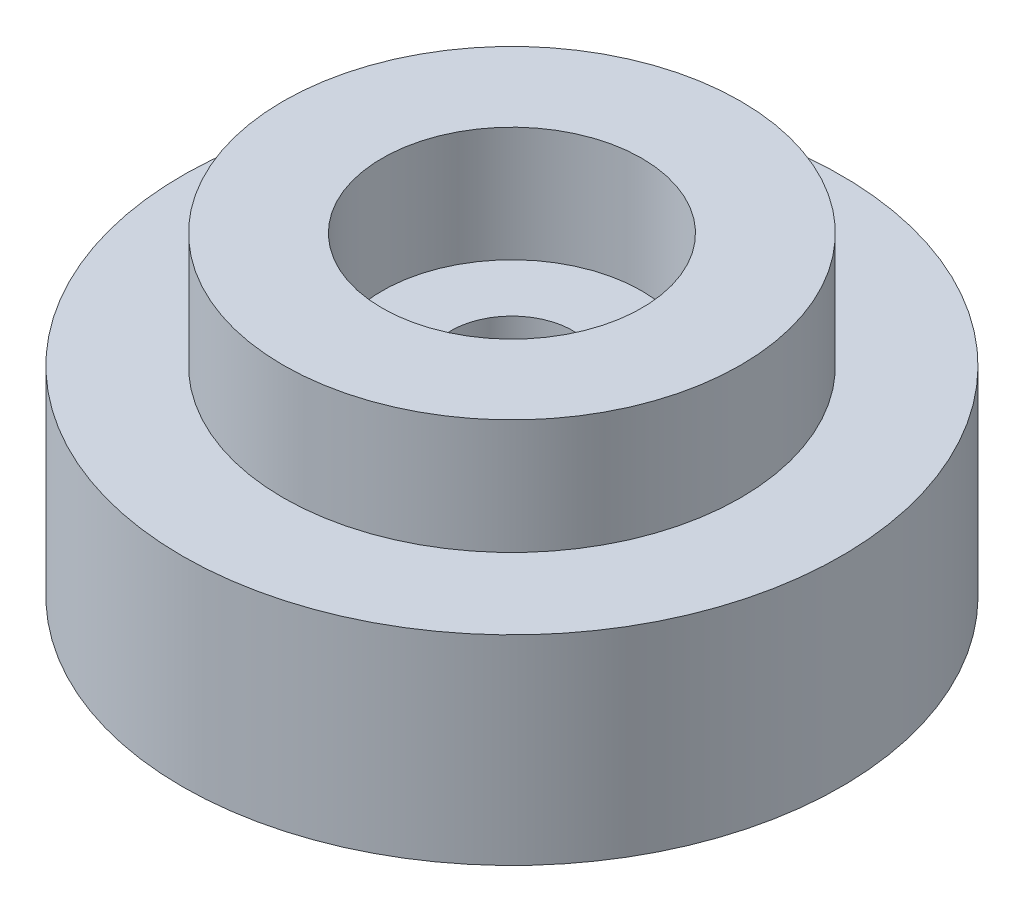
ISO-10303-21;
HEADER;
FILE_DESCRIPTION(('STEP AP214'),'2;1');
FILE_NAME('part.step','',(''),(''),'','','');
FILE_SCHEMA(('AUTOMOTIVE_DESIGN { 1 0 10303 214 1 1 1 1 }'));
ENDSEC;
DATA;
#1=APPLICATION_CONTEXT('core data for automotive mechanical design processes');
#2=APPLICATION_PROTOCOL_DEFINITION('international standard','automotive_design',2000,#1);
#3=PRODUCT_CONTEXT('',#1,'mechanical');
#4=PRODUCT('Part','Part','',(#3));
#5=PRODUCT_RELATED_PRODUCT_CATEGORY('part','',(#4));
#6=PRODUCT_DEFINITION_FORMATION('','',#4);
#7=PRODUCT_DEFINITION_CONTEXT('part definition',#1,'design');
#8=PRODUCT_DEFINITION('design','',#6,#7);
#9=PRODUCT_DEFINITION_SHAPE('','',#8);
#10=(LENGTH_UNIT() NAMED_UNIT(*) SI_UNIT(.MILLI.,.METRE.));
#11=(NAMED_UNIT(*) PLANE_ANGLE_UNIT() SI_UNIT($,.RADIAN.));
#12=(NAMED_UNIT(*) SI_UNIT($,.STERADIAN.) SOLID_ANGLE_UNIT());
#13=UNCERTAINTY_MEASURE_WITH_UNIT(LENGTH_MEASURE(1.E-05),#10,'distance_accuracy_value','');
#14=(GEOMETRIC_REPRESENTATION_CONTEXT(3) GLOBAL_UNCERTAINTY_ASSIGNED_CONTEXT((#13)) GLOBAL_UNIT_ASSIGNED_CONTEXT((#10,
#11,#12)) REPRESENTATION_CONTEXT('',''));
#15=CARTESIAN_POINT('',(0.,0.,0.));
#16=DIRECTION('',(0.,0.,1.));
#17=DIRECTION('',(1.,0.,0.));
#18=AXIS2_PLACEMENT_3D('',#15,#16,#17);
#19=CARTESIAN_POINT('',(0.,10.,0.));
#20=DIRECTION('',(0.,-1.,0.));
#21=DIRECTION('',(0.,0.,-1.));
#22=AXIS2_PLACEMENT_3D('',#19,#20,#21);
#23=CYLINDRICAL_SURFACE('',#22,16.5);
#24=CARTESIAN_POINT('',(0.,10.,0.));
#25=DIRECTION('',(0.,1.,0.));
#26=DIRECTION('',(0.,0.,1.));
#27=AXIS2_PLACEMENT_3D('',#24,#25,#26);
#28=CIRCLE('',#27,16.5);
#29=CARTESIAN_POINT('',(0.,10.,16.5));
#30=VERTEX_POINT('',#29);
#31=EDGE_CURVE('E42',#30,#30,#28,.T.);
#32=ORIENTED_EDGE('',*,*,#31,.F.);
#33=EDGE_LOOP('',(#32));
#34=FACE_BOUND('',#33,.T.);
#35=CARTESIAN_POINT('',(0.,0.,0.));
#36=DIRECTION('',(0.,1.,0.));
#37=DIRECTION('',(0.,0.,1.));
#38=AXIS2_PLACEMENT_3D('',#35,#36,#37);
#39=CIRCLE('',#38,16.5);
#40=CARTESIAN_POINT('',(0.,0.,16.5));
#41=VERTEX_POINT('',#40);
#42=EDGE_CURVE('E47',#41,#41,#39,.T.);
#43=ORIENTED_EDGE('',*,*,#42,.T.);
#44=EDGE_LOOP('',(#43));
#45=FACE_BOUND('',#44,.T.);
#46=ADVANCED_FACE('F35',(#34,#45),#23,.T.);
#47=CARTESIAN_POINT('',(0.,10.,0.));
#48=DIRECTION('',(0.,1.,0.));
#49=DIRECTION('',(0.,0.,1.));
#50=AXIS2_PLACEMENT_3D('',#47,#48,#49);
#51=PLANE('',#50);
#52=CARTESIAN_POINT('',(0.,10.,0.));
#53=DIRECTION('',(0.,-1.,0.));
#54=DIRECTION('',(0.,0.,-1.));
#55=AXIS2_PLACEMENT_3D('',#52,#53,#54);
#56=CIRCLE('',#55,11.45);
#57=CARTESIAN_POINT('',(0.,10.,-11.45));
#58=VERTEX_POINT('',#57);
#59=EDGE_CURVE('E52',#58,#58,#56,.T.);
#60=ORIENTED_EDGE('',*,*,#59,.T.);
#61=EDGE_LOOP('',(#60));
#62=FACE_BOUND('',#61,.T.);
#63=ORIENTED_EDGE('',*,*,#31,.T.);
#64=EDGE_LOOP('',(#63));
#65=FACE_BOUND('',#64,.T.);
#66=ADVANCED_FACE('F73',(#62,#65),#51,.T.);
#67=CARTESIAN_POINT('',(0.,0.,0.));
#68=DIRECTION('',(0.,1.,0.));
#69=DIRECTION('',(0.,0.,1.));
#70=AXIS2_PLACEMENT_3D('',#67,#68,#69);
#71=PLANE('',#70);
#72=CARTESIAN_POINT('',(0.,0.,0.));
#73=DIRECTION('',(0.,1.,0.));
#74=DIRECTION('',(0.,0.,1.));
#75=AXIS2_PLACEMENT_3D('',#72,#73,#74);
#76=CIRCLE('',#75,2.);
#77=CARTESIAN_POINT('',(0.,0.,2.));
#78=VERTEX_POINT('',#77);
#79=EDGE_CURVE('E51',#78,#78,#76,.T.);
#80=ORIENTED_EDGE('',*,*,#79,.T.);
#81=EDGE_LOOP('',(#80));
#82=FACE_BOUND('',#81,.T.);
#83=ORIENTED_EDGE('',*,*,#42,.F.);
#84=EDGE_LOOP('',(#83));
#85=FACE_BOUND('',#84,.T.);
#86=ADVANCED_FACE('F70',(#82,#85),#71,.F.);
#87=CARTESIAN_POINT('',(0.,-0.517946451325177,0.));
#88=DIRECTION('',(0.,-1.,0.));
#89=DIRECTION('',(0.,0.,-1.));
#90=AXIS2_PLACEMENT_3D('',#87,#88,#89);
#91=CYLINDRICAL_SURFACE('',#90,6.5);
#92=CARTESIAN_POINT('',(0.,10.,0.));
#93=DIRECTION('',(0.,-1.,0.));
#94=DIRECTION('',(0.,0.,-1.));
#95=AXIS2_PLACEMENT_3D('',#92,#93,#94);
#96=CIRCLE('',#95,6.5);
#97=CARTESIAN_POINT('',(0.,10.,-6.5));
#98=VERTEX_POINT('',#97);
#99=EDGE_CURVE('E10',#98,#98,#96,.T.);
#100=ORIENTED_EDGE('',*,*,#99,.T.);
#101=EDGE_LOOP('',(#100));
#102=FACE_BOUND('',#101,.T.);
#103=CARTESIAN_POINT('',(0.,15.75,0.));
#104=DIRECTION('',(0.,-1.,0.));
#105=DIRECTION('',(0.,0.,-1.));
#106=AXIS2_PLACEMENT_3D('',#103,#104,#105);
#107=CIRCLE('',#106,6.5);
#108=CARTESIAN_POINT('',(0.,15.75,-6.5));
#109=VERTEX_POINT('',#108);
#110=EDGE_CURVE('E58',#109,#109,#107,.T.);
#111=ORIENTED_EDGE('',*,*,#110,.F.);
#112=EDGE_LOOP('',(#111));
#113=FACE_BOUND('',#112,.T.);
#114=ADVANCED_FACE('F72',(#102,#113),#91,.F.);
#115=CARTESIAN_POINT('',(6.5,15.75,0.));
#116=DIRECTION('',(0.,1.,0.));
#117=DIRECTION('',(0.,0.,1.));
#118=AXIS2_PLACEMENT_3D('',#115,#116,#117);
#119=PLANE('',#118);
#120=ORIENTED_EDGE('',*,*,#110,.T.);
#121=EDGE_LOOP('',(#120));
#122=FACE_BOUND('',#121,.T.);
#123=CARTESIAN_POINT('',(0.,15.75,0.));
#124=DIRECTION('',(0.,-1.,0.));
#125=DIRECTION('',(0.,0.,-1.));
#126=AXIS2_PLACEMENT_3D('',#123,#124,#125);
#127=CIRCLE('',#126,11.45);
#128=CARTESIAN_POINT('',(0.,15.75,-11.45));
#129=VERTEX_POINT('',#128);
#130=EDGE_CURVE('E55',#129,#129,#127,.T.);
#131=ORIENTED_EDGE('',*,*,#130,.F.);
#132=EDGE_LOOP('',(#131));
#133=FACE_BOUND('',#132,.T.);
#134=ADVANCED_FACE('F79',(#122,#133),#119,.T.);
#135=CARTESIAN_POINT('',(0.,-0.517946451325177,0.));
#136=DIRECTION('',(0.,-1.,0.));
#137=DIRECTION('',(0.,0.,-1.));
#138=AXIS2_PLACEMENT_3D('',#135,#136,#137);
#139=CYLINDRICAL_SURFACE('',#138,11.45);
#140=ORIENTED_EDGE('',*,*,#130,.T.);
#141=EDGE_LOOP('',(#140));
#142=FACE_BOUND('',#141,.T.);
#143=ORIENTED_EDGE('',*,*,#59,.F.);
#144=EDGE_LOOP('',(#143));
#145=FACE_BOUND('',#144,.T.);
#146=ADVANCED_FACE('F119',(#142,#145),#139,.T.);
#147=CARTESIAN_POINT('',(0.,8.75,0.));
#148=DIRECTION('',(0.,1.,0.));
#149=DIRECTION('',(0.,0.,1.));
#150=AXIS2_PLACEMENT_3D('',#147,#148,#149);
#151=PLANE('',#150);
#152=CARTESIAN_POINT('',(0.,8.75,0.));
#153=DIRECTION('',(0.,1.,0.));
#154=DIRECTION('',(0.,0.,1.));
#155=AXIS2_PLACEMENT_3D('',#152,#153,#154);
#156=CIRCLE('',#155,2.);
#157=CARTESIAN_POINT('',(0.,8.75,2.));
#158=VERTEX_POINT('',#157);
#159=EDGE_CURVE('E38',#158,#158,#156,.T.);
#160=ORIENTED_EDGE('',*,*,#159,.F.);
#161=EDGE_LOOP('',(#160));
#162=FACE_BOUND('',#161,.T.);
#163=CARTESIAN_POINT('',(0.,8.75,0.));
#164=DIRECTION('',(0.,1.,0.));
#165=DIRECTION('',(0.,0.,1.));
#166=AXIS2_PLACEMENT_3D('',#163,#164,#165);
#167=CIRCLE('',#166,3.05);
#168=CARTESIAN_POINT('',(0.,8.75,3.05));
#169=VERTEX_POINT('',#168);
#170=EDGE_CURVE('E62',#169,#169,#167,.T.);
#171=ORIENTED_EDGE('',*,*,#170,.T.);
#172=EDGE_LOOP('',(#171));
#173=FACE_BOUND('',#172,.T.);
#174=ADVANCED_FACE('F130',(#162,#173),#151,.T.);
#175=CARTESIAN_POINT('',(0.,8.75,0.));
#176=DIRECTION('',(0.,1.,0.));
#177=DIRECTION('',(0.,0.,1.));
#178=AXIS2_PLACEMENT_3D('',#175,#176,#177);
#179=CYLINDRICAL_SURFACE('',#178,3.05);
#180=ORIENTED_EDGE('',*,*,#170,.F.);
#181=EDGE_LOOP('',(#180));
#182=FACE_BOUND('',#181,.T.);
#183=CARTESIAN_POINT('',(0.,10.,0.));
#184=DIRECTION('',(0.,1.,0.));
#185=DIRECTION('',(0.,0.,1.));
#186=AXIS2_PLACEMENT_3D('',#183,#184,#185);
#187=CIRCLE('',#186,3.05);
#188=CARTESIAN_POINT('',(0.,10.,3.05));
#189=VERTEX_POINT('',#188);
#190=EDGE_CURVE('E61',#189,#189,#187,.T.);
#191=ORIENTED_EDGE('',*,*,#190,.T.);
#192=EDGE_LOOP('',(#191));
#193=FACE_BOUND('',#192,.T.);
#194=ADVANCED_FACE('F103',(#182,#193),#179,.F.);
#195=ORIENTED_EDGE('',*,*,#190,.F.);
#196=EDGE_LOOP('',(#195));
#197=FACE_BOUND('',#196,.T.);
#198=ORIENTED_EDGE('',*,*,#99,.F.);
#199=EDGE_LOOP('',(#198));
#200=FACE_BOUND('',#199,.T.);
#201=ADVANCED_FACE('F83',(#197,#200),#51,.T.);
#202=CARTESIAN_POINT('',(0.,0.,0.));
#203=DIRECTION('',(0.,1.,0.));
#204=DIRECTION('',(0.,0.,1.));
#205=AXIS2_PLACEMENT_3D('',#202,#203,#204);
#206=CYLINDRICAL_SURFACE('',#205,2.);
#207=ORIENTED_EDGE('',*,*,#159,.T.);
#208=EDGE_LOOP('',(#207));
#209=FACE_BOUND('',#208,.T.);
#210=ORIENTED_EDGE('',*,*,#79,.F.);
#211=EDGE_LOOP('',(#210));
#212=FACE_BOUND('',#211,.T.);
#213=ADVANCED_FACE('F142',(#209,#212),#206,.F.);
#214=CLOSED_SHELL('',(#46,#66,#86,#114,#134,#146,#174,#194,#201,#213));
#215=MANIFOLD_SOLID_BREP('B2',#214);
#216=ADVANCED_BREP_SHAPE_REPRESENTATION('',(#18,#215),#14);
#217=SHAPE_DEFINITION_REPRESENTATION(#9,#216);
ENDSEC;
END-ISO-10303-21;
